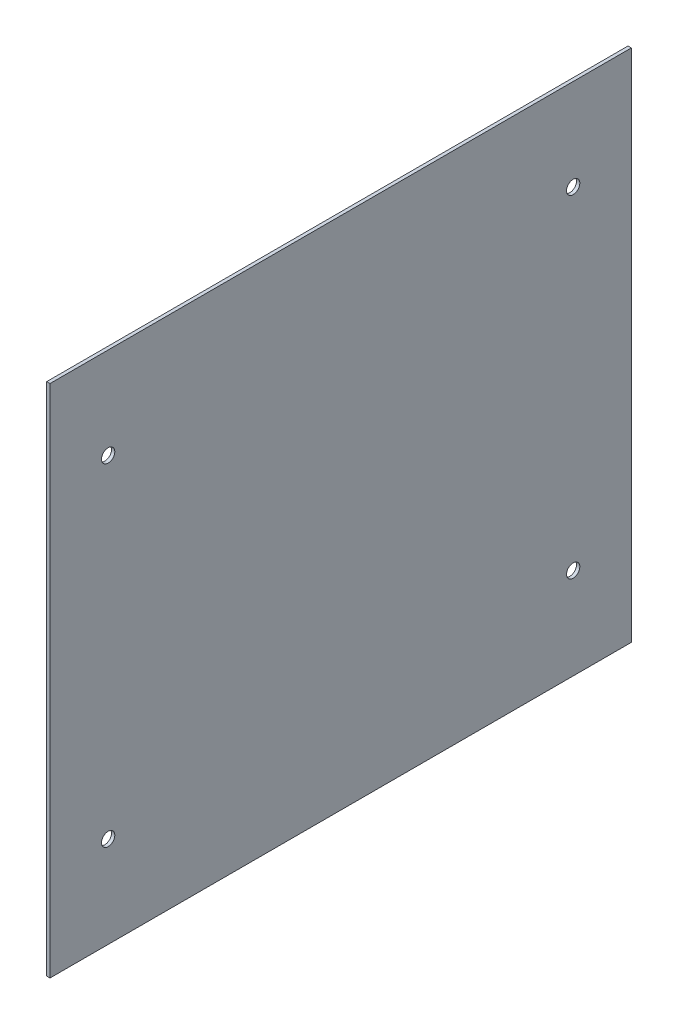
ISO-10303-21;
HEADER;
FILE_DESCRIPTION(('STEP AP214'),'2;1');
FILE_NAME('part.step','',(''),(''),'','','');
FILE_SCHEMA(('AUTOMOTIVE_DESIGN { 1 0 10303 214 1 1 1 1 }'));
ENDSEC;
DATA;
#1=APPLICATION_CONTEXT('core data for automotive mechanical design processes');
#2=APPLICATION_PROTOCOL_DEFINITION('international standard','automotive_design',2000,#1);
#3=PRODUCT_CONTEXT('',#1,'mechanical');
#4=PRODUCT('Part','Part','',(#3));
#5=PRODUCT_RELATED_PRODUCT_CATEGORY('part','',(#4));
#6=PRODUCT_DEFINITION_FORMATION('','',#4);
#7=PRODUCT_DEFINITION_CONTEXT('part definition',#1,'design');
#8=PRODUCT_DEFINITION('design','',#6,#7);
#9=PRODUCT_DEFINITION_SHAPE('','',#8);
#10=(LENGTH_UNIT() NAMED_UNIT(*) SI_UNIT(.MILLI.,.METRE.));
#11=(NAMED_UNIT(*) PLANE_ANGLE_UNIT() SI_UNIT($,.RADIAN.));
#12=(NAMED_UNIT(*) SI_UNIT($,.STERADIAN.) SOLID_ANGLE_UNIT());
#13=UNCERTAINTY_MEASURE_WITH_UNIT(LENGTH_MEASURE(1.E-05),#10,'distance_accuracy_value','');
#14=(GEOMETRIC_REPRESENTATION_CONTEXT(3) GLOBAL_UNCERTAINTY_ASSIGNED_CONTEXT((#13)) GLOBAL_UNIT_ASSIGNED_CONTEXT((#10,
#11,#12)) REPRESENTATION_CONTEXT('',''));
#15=CARTESIAN_POINT('',(0.,0.,0.));
#16=DIRECTION('',(0.,0.,1.));
#17=DIRECTION('',(1.,0.,0.));
#18=AXIS2_PLACEMENT_3D('',#15,#16,#17);
#19=CARTESIAN_POINT('',(2.,-155.,175.));
#20=DIRECTION('',(0.,0.,-1.));
#21=DIRECTION('',(-1.,0.,0.));
#22=AXIS2_PLACEMENT_3D('',#19,#20,#21);
#23=PLANE('',#22);
#24=DIRECTION('',(0.,-1.,0.));
#25=VECTOR('',#24,1.);
#26=CARTESIAN_POINT('',(0.,-155.,175.));
#27=LINE('',#26,#25);
#28=CARTESIAN_POINT('',(0.,155.,175.));
#29=VERTEX_POINT('',#28);
#30=CARTESIAN_POINT('',(0.,-155.,175.));
#31=VERTEX_POINT('',#30);
#32=EDGE_CURVE('E96',#29,#31,#27,.T.);
#33=ORIENTED_EDGE('',*,*,#32,.T.);
#34=DIRECTION('',(-1.,0.,0.));
#35=VECTOR('',#34,1.);
#36=CARTESIAN_POINT('',(2.,-155.,175.));
#37=LINE('',#36,#35);
#38=CARTESIAN_POINT('',(2.,-155.,175.));
#39=VERTEX_POINT('',#38);
#40=EDGE_CURVE('E11',#39,#31,#37,.T.);
#41=ORIENTED_EDGE('',*,*,#40,.F.);
#42=DIRECTION('',(0.,-1.,0.));
#43=VECTOR('',#42,1.);
#44=CARTESIAN_POINT('',(2.,-155.,175.));
#45=LINE('',#44,#43);
#46=CARTESIAN_POINT('',(2.,155.,175.));
#47=VERTEX_POINT('',#46);
#48=EDGE_CURVE('E84',#47,#39,#45,.T.);
#49=ORIENTED_EDGE('',*,*,#48,.F.);
#50=DIRECTION('',(-1.,0.,0.));
#51=VECTOR('',#50,1.);
#52=CARTESIAN_POINT('',(2.,155.,175.));
#53=LINE('',#52,#51);
#54=EDGE_CURVE('E92',#47,#29,#53,.T.);
#55=ORIENTED_EDGE('',*,*,#54,.T.);
#56=EDGE_LOOP('',(#33,#41,#49,#55));
#57=FACE_BOUND('',#56,.T.);
#58=ADVANCED_FACE('F33',(#57),#23,.F.);
#59=CARTESIAN_POINT('',(2.,-155.,-175.));
#60=DIRECTION('',(0.,1.,0.));
#61=DIRECTION('',(0.,0.,1.));
#62=AXIS2_PLACEMENT_3D('',#59,#60,#61);
#63=PLANE('',#62);
#64=DIRECTION('',(0.,0.,-1.));
#65=VECTOR('',#64,1.);
#66=CARTESIAN_POINT('',(0.,-155.,-175.));
#67=LINE('',#66,#65);
#68=CARTESIAN_POINT('',(0.,-155.,-175.));
#69=VERTEX_POINT('',#68);
#70=EDGE_CURVE('E88',#31,#69,#67,.T.);
#71=ORIENTED_EDGE('',*,*,#70,.T.);
#72=DIRECTION('',(-1.,0.,0.));
#73=VECTOR('',#72,1.);
#74=CARTESIAN_POINT('',(2.,-155.,-175.));
#75=LINE('',#74,#73);
#76=CARTESIAN_POINT('',(2.,-155.,-175.));
#77=VERTEX_POINT('',#76);
#78=EDGE_CURVE('E41',#77,#69,#75,.T.);
#79=ORIENTED_EDGE('',*,*,#78,.F.);
#80=DIRECTION('',(0.,0.,-1.));
#81=VECTOR('',#80,1.);
#82=CARTESIAN_POINT('',(2.,-155.,-175.));
#83=LINE('',#82,#81);
#84=EDGE_CURVE('E79',#39,#77,#83,.T.);
#85=ORIENTED_EDGE('',*,*,#84,.F.);
#86=ORIENTED_EDGE('',*,*,#40,.T.);
#87=EDGE_LOOP('',(#71,#79,#85,#86));
#88=FACE_BOUND('',#87,.T.);
#89=ADVANCED_FACE('F87',(#88),#63,.F.);
#90=CARTESIAN_POINT('',(2.,-155.,-175.));
#91=DIRECTION('',(0.,0.,1.));
#92=DIRECTION('',(1.,0.,0.));
#93=AXIS2_PLACEMENT_3D('',#90,#91,#92);
#94=PLANE('',#93);
#95=DIRECTION('',(0.,1.,0.));
#96=VECTOR('',#95,1.);
#97=CARTESIAN_POINT('',(0.,-155.,-175.));
#98=LINE('',#97,#96);
#99=CARTESIAN_POINT('',(0.,155.,-175.));
#100=VERTEX_POINT('',#99);
#101=EDGE_CURVE('E66',#69,#100,#98,.T.);
#102=ORIENTED_EDGE('',*,*,#101,.T.);
#103=DIRECTION('',(-1.,0.,0.));
#104=VECTOR('',#103,1.);
#105=CARTESIAN_POINT('',(2.,155.,-175.));
#106=LINE('',#105,#104);
#107=CARTESIAN_POINT('',(2.,155.,-175.));
#108=VERTEX_POINT('',#107);
#109=EDGE_CURVE('E89',#108,#100,#106,.T.);
#110=ORIENTED_EDGE('',*,*,#109,.F.);
#111=DIRECTION('',(0.,1.,0.));
#112=VECTOR('',#111,1.);
#113=CARTESIAN_POINT('',(2.,-155.,-175.));
#114=LINE('',#113,#112);
#115=EDGE_CURVE('E82',#77,#108,#114,.T.);
#116=ORIENTED_EDGE('',*,*,#115,.F.);
#117=ORIENTED_EDGE('',*,*,#78,.T.);
#118=EDGE_LOOP('',(#102,#110,#116,#117));
#119=FACE_BOUND('',#118,.T.);
#120=ADVANCED_FACE('F90',(#119),#94,.F.);
#121=CARTESIAN_POINT('',(2.,155.,-175.));
#122=DIRECTION('',(0.,-1.,0.));
#123=DIRECTION('',(0.,0.,-1.));
#124=AXIS2_PLACEMENT_3D('',#121,#122,#123);
#125=PLANE('',#124);
#126=DIRECTION('',(0.,0.,1.));
#127=VECTOR('',#126,1.);
#128=CARTESIAN_POINT('',(0.,155.,-175.));
#129=LINE('',#128,#127);
#130=EDGE_CURVE('E72',#100,#29,#129,.T.);
#131=ORIENTED_EDGE('',*,*,#130,.T.);
#132=ORIENTED_EDGE('',*,*,#54,.F.);
#133=DIRECTION('',(0.,0.,1.));
#134=VECTOR('',#133,1.);
#135=CARTESIAN_POINT('',(2.,155.,-175.));
#136=LINE('',#135,#134);
#137=EDGE_CURVE('E49',#108,#47,#136,.T.);
#138=ORIENTED_EDGE('',*,*,#137,.F.);
#139=ORIENTED_EDGE('',*,*,#109,.T.);
#140=EDGE_LOOP('',(#131,#132,#138,#139));
#141=FACE_BOUND('',#140,.T.);
#142=ADVANCED_FACE('F104',(#141),#125,.F.);
#143=CARTESIAN_POINT('',(2.,0.,0.));
#144=DIRECTION('',(1.,0.,0.));
#145=DIRECTION('',(0.,0.,-1.));
#146=AXIS2_PLACEMENT_3D('',#143,#144,#145);
#147=PLANE('',#146);
#148=CARTESIAN_POINT('',(2.,-100.,140.));
#149=DIRECTION('',(1.,0.,0.));
#150=DIRECTION('',(0.,0.,1.));
#151=AXIS2_PLACEMENT_3D('',#148,#149,#150);
#152=CIRCLE('',#151,3.99999999999999);
#153=CARTESIAN_POINT('',(2.,-100.,144.));
#154=VERTEX_POINT('',#153);
#155=EDGE_CURVE('E128',#154,#154,#152,.T.);
#156=ORIENTED_EDGE('',*,*,#155,.F.);
#157=EDGE_LOOP('',(#156));
#158=FACE_BOUND('',#157,.T.);
#159=CARTESIAN_POINT('',(2.,-100.,-140.));
#160=DIRECTION('',(1.,0.,0.));
#161=DIRECTION('',(0.,0.,-1.));
#162=AXIS2_PLACEMENT_3D('',#159,#160,#161);
#163=CIRCLE('',#162,3.99999999999999);
#164=CARTESIAN_POINT('',(2.,-100.,-144.));
#165=VERTEX_POINT('',#164);
#166=EDGE_CURVE('E122',#165,#165,#163,.T.);
#167=ORIENTED_EDGE('',*,*,#166,.F.);
#168=EDGE_LOOP('',(#167));
#169=FACE_BOUND('',#168,.T.);
#170=CARTESIAN_POINT('',(2.,100.,-140.));
#171=DIRECTION('',(1.,0.,0.));
#172=DIRECTION('',(0.,0.,1.));
#173=AXIS2_PLACEMENT_3D('',#170,#171,#172);
#174=CIRCLE('',#173,3.99999999999999);
#175=CARTESIAN_POINT('',(2.,100.,-136.));
#176=VERTEX_POINT('',#175);
#177=EDGE_CURVE('E116',#176,#176,#174,.T.);
#178=ORIENTED_EDGE('',*,*,#177,.F.);
#179=EDGE_LOOP('',(#178));
#180=FACE_BOUND('',#179,.T.);
#181=CARTESIAN_POINT('',(2.,100.,140.));
#182=DIRECTION('',(1.,0.,0.));
#183=DIRECTION('',(0.,0.,-1.));
#184=AXIS2_PLACEMENT_3D('',#181,#182,#183);
#185=CIRCLE('',#184,3.99999999999999);
#186=CARTESIAN_POINT('',(2.,100.,136.));
#187=VERTEX_POINT('',#186);
#188=EDGE_CURVE('E110',#187,#187,#185,.T.);
#189=ORIENTED_EDGE('',*,*,#188,.F.);
#190=EDGE_LOOP('',(#189));
#191=FACE_BOUND('',#190,.T.);
#192=ORIENTED_EDGE('',*,*,#48,.T.);
#193=ORIENTED_EDGE('',*,*,#84,.T.);
#194=ORIENTED_EDGE('',*,*,#115,.T.);
#195=ORIENTED_EDGE('',*,*,#137,.T.);
#196=EDGE_LOOP('',(#192,#193,#194,#195));
#197=FACE_BOUND('',#196,.T.);
#198=ADVANCED_FACE('F80',(#158,#169,#180,#191,#197),#147,.T.);
#199=CARTESIAN_POINT('',(0.,0.,0.));
#200=DIRECTION('',(1.,0.,0.));
#201=DIRECTION('',(0.,0.,-1.));
#202=AXIS2_PLACEMENT_3D('',#199,#200,#201);
#203=PLANE('',#202);
#204=CARTESIAN_POINT('',(0.,-100.,140.));
#205=DIRECTION('',(1.,0.,0.));
#206=DIRECTION('',(0.,0.,1.));
#207=AXIS2_PLACEMENT_3D('',#204,#205,#206);
#208=CIRCLE('',#207,3.99999999999999);
#209=CARTESIAN_POINT('',(0.,-100.,144.));
#210=VERTEX_POINT('',#209);
#211=EDGE_CURVE('E113',#210,#210,#208,.T.);
#212=ORIENTED_EDGE('',*,*,#211,.T.);
#213=EDGE_LOOP('',(#212));
#214=FACE_BOUND('',#213,.T.);
#215=CARTESIAN_POINT('',(0.,-100.,-140.));
#216=DIRECTION('',(1.,0.,0.));
#217=DIRECTION('',(0.,0.,-1.));
#218=AXIS2_PLACEMENT_3D('',#215,#216,#217);
#219=CIRCLE('',#218,3.99999999999999);
#220=CARTESIAN_POINT('',(0.,-100.,-144.));
#221=VERTEX_POINT('',#220);
#222=EDGE_CURVE('E125',#221,#221,#219,.T.);
#223=ORIENTED_EDGE('',*,*,#222,.T.);
#224=EDGE_LOOP('',(#223));
#225=FACE_BOUND('',#224,.T.);
#226=CARTESIAN_POINT('',(0.,100.,-140.));
#227=DIRECTION('',(1.,0.,0.));
#228=DIRECTION('',(0.,0.,1.));
#229=AXIS2_PLACEMENT_3D('',#226,#227,#228);
#230=CIRCLE('',#229,3.99999999999999);
#231=CARTESIAN_POINT('',(0.,100.,-136.));
#232=VERTEX_POINT('',#231);
#233=EDGE_CURVE('E119',#232,#232,#230,.T.);
#234=ORIENTED_EDGE('',*,*,#233,.T.);
#235=EDGE_LOOP('',(#234));
#236=FACE_BOUND('',#235,.T.);
#237=CARTESIAN_POINT('',(0.,100.,140.));
#238=DIRECTION('',(1.,0.,0.));
#239=DIRECTION('',(0.,0.,-1.));
#240=AXIS2_PLACEMENT_3D('',#237,#238,#239);
#241=CIRCLE('',#240,3.99999999999999);
#242=CARTESIAN_POINT('',(0.,100.,136.));
#243=VERTEX_POINT('',#242);
#244=EDGE_CURVE('E99',#243,#243,#241,.T.);
#245=ORIENTED_EDGE('',*,*,#244,.T.);
#246=EDGE_LOOP('',(#245));
#247=FACE_BOUND('',#246,.T.);
#248=ORIENTED_EDGE('',*,*,#32,.F.);
#249=ORIENTED_EDGE('',*,*,#130,.F.);
#250=ORIENTED_EDGE('',*,*,#101,.F.);
#251=ORIENTED_EDGE('',*,*,#70,.F.);
#252=EDGE_LOOP('',(#248,#249,#250,#251));
#253=FACE_BOUND('',#252,.T.);
#254=ADVANCED_FACE('F107',(#214,#225,#236,#247,#253),#203,.F.);
#255=CARTESIAN_POINT('',(0.,100.,140.));
#256=DIRECTION('',(1.,0.,0.));
#257=DIRECTION('',(0.,0.,-1.));
#258=AXIS2_PLACEMENT_3D('',#255,#256,#257);
#259=CYLINDRICAL_SURFACE('',#258,3.99999999999999);
#260=ORIENTED_EDGE('',*,*,#244,.F.);
#261=EDGE_LOOP('',(#260));
#262=FACE_BOUND('',#261,.T.);
#263=ORIENTED_EDGE('',*,*,#188,.T.);
#264=EDGE_LOOP('',(#263));
#265=FACE_BOUND('',#264,.T.);
#266=ADVANCED_FACE('F152',(#262,#265),#259,.F.);
#267=CARTESIAN_POINT('',(0.,100.,-140.));
#268=DIRECTION('',(1.,0.,0.));
#269=DIRECTION('',(0.,0.,-1.));
#270=AXIS2_PLACEMENT_3D('',#267,#268,#269);
#271=CYLINDRICAL_SURFACE('',#270,3.99999999999999);
#272=ORIENTED_EDGE('',*,*,#233,.F.);
#273=EDGE_LOOP('',(#272));
#274=FACE_BOUND('',#273,.T.);
#275=ORIENTED_EDGE('',*,*,#177,.T.);
#276=EDGE_LOOP('',(#275));
#277=FACE_BOUND('',#276,.T.);
#278=ADVANCED_FACE('F154',(#274,#277),#271,.F.);
#279=CARTESIAN_POINT('',(0.,-100.,-140.));
#280=DIRECTION('',(1.,0.,0.));
#281=DIRECTION('',(0.,0.,-1.));
#282=AXIS2_PLACEMENT_3D('',#279,#280,#281);
#283=CYLINDRICAL_SURFACE('',#282,3.99999999999999);
#284=ORIENTED_EDGE('',*,*,#222,.F.);
#285=EDGE_LOOP('',(#284));
#286=FACE_BOUND('',#285,.T.);
#287=ORIENTED_EDGE('',*,*,#166,.T.);
#288=EDGE_LOOP('',(#287));
#289=FACE_BOUND('',#288,.T.);
#290=ADVANCED_FACE('F139',(#286,#289),#283,.F.);
#291=CARTESIAN_POINT('',(0.,-100.,140.));
#292=DIRECTION('',(1.,0.,0.));
#293=DIRECTION('',(0.,0.,-1.));
#294=AXIS2_PLACEMENT_3D('',#291,#292,#293);
#295=CYLINDRICAL_SURFACE('',#294,3.99999999999999);
#296=ORIENTED_EDGE('',*,*,#211,.F.);
#297=EDGE_LOOP('',(#296));
#298=FACE_BOUND('',#297,.T.);
#299=ORIENTED_EDGE('',*,*,#155,.T.);
#300=EDGE_LOOP('',(#299));
#301=FACE_BOUND('',#300,.T.);
#302=ADVANCED_FACE('F136',(#298,#301),#295,.F.);
#303=CLOSED_SHELL('',(#58,#89,#120,#142,#198,#254,#266,#278,#290,#302));
#304=MANIFOLD_SOLID_BREP('B2',#303);
#305=ADVANCED_BREP_SHAPE_REPRESENTATION('',(#18,#304),#14);
#306=SHAPE_DEFINITION_REPRESENTATION(#9,#305);
ENDSEC;
END-ISO-10303-21;
